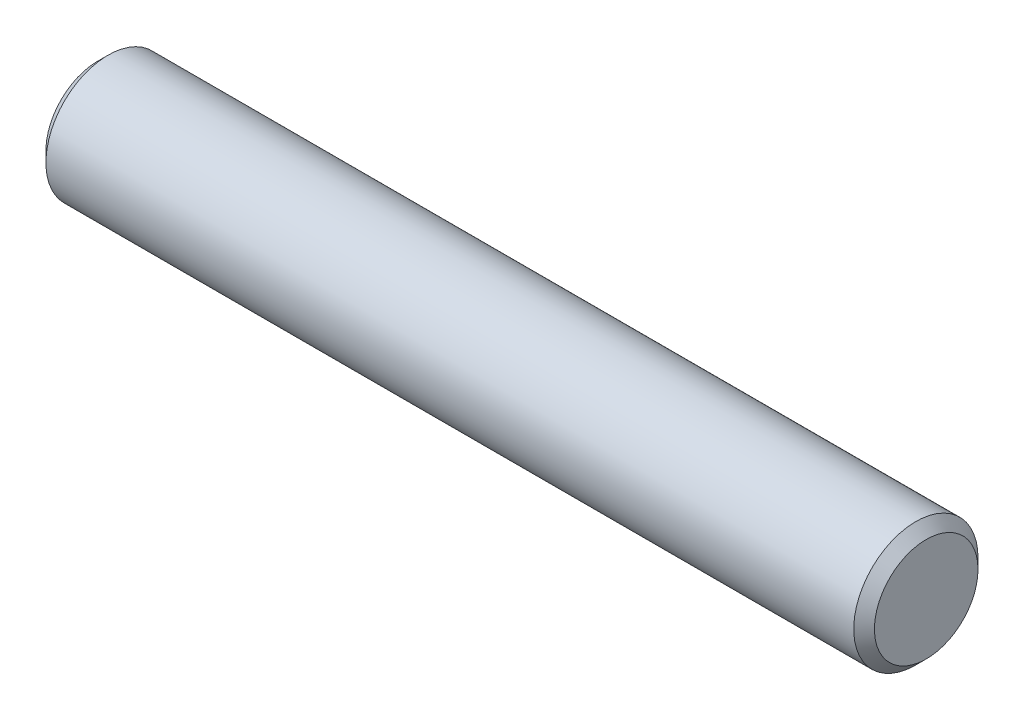
ISO-10303-21;
HEADER;
FILE_DESCRIPTION(('STEP AP214'),'2;1');
FILE_NAME('part.step','',(''),(''),'','','');
FILE_SCHEMA(('AUTOMOTIVE_DESIGN { 1 0 10303 214 1 1 1 1 }'));
ENDSEC;
DATA;
#1=APPLICATION_CONTEXT('core data for automotive mechanical design processes');
#2=APPLICATION_PROTOCOL_DEFINITION('international standard','automotive_design',2000,#1);
#3=PRODUCT_CONTEXT('',#1,'mechanical');
#4=PRODUCT('Part','Part','',(#3));
#5=PRODUCT_RELATED_PRODUCT_CATEGORY('part','',(#4));
#6=PRODUCT_DEFINITION_FORMATION('','',#4);
#7=PRODUCT_DEFINITION_CONTEXT('part definition',#1,'design');
#8=PRODUCT_DEFINITION('design','',#6,#7);
#9=PRODUCT_DEFINITION_SHAPE('','',#8);
#10=(LENGTH_UNIT() NAMED_UNIT(*) SI_UNIT(.MILLI.,.METRE.));
#11=(NAMED_UNIT(*) PLANE_ANGLE_UNIT() SI_UNIT($,.RADIAN.));
#12=(NAMED_UNIT(*) SI_UNIT($,.STERADIAN.) SOLID_ANGLE_UNIT());
#13=UNCERTAINTY_MEASURE_WITH_UNIT(LENGTH_MEASURE(1.E-05),#10,'distance_accuracy_value','');
#14=(GEOMETRIC_REPRESENTATION_CONTEXT(3) GLOBAL_UNCERTAINTY_ASSIGNED_CONTEXT((#13)) GLOBAL_UNIT_ASSIGNED_CONTEXT((#10,
#11,#12)) REPRESENTATION_CONTEXT('',''));
#15=CARTESIAN_POINT('',(0.,0.,0.));
#16=DIRECTION('',(0.,0.,1.));
#17=DIRECTION('',(1.,0.,0.));
#18=AXIS2_PLACEMENT_3D('',#15,#16,#17);
#19=CARTESIAN_POINT('',(20.,0.,0.));
#20=DIRECTION('',(-1.,0.,0.));
#21=DIRECTION('',(0.,0.,1.));
#22=AXIS2_PLACEMENT_3D('',#19,#20,#21);
#23=CYLINDRICAL_SURFACE('',#22,3.);
#24=CARTESIAN_POINT('',(-19.5,0.,0.));
#25=DIRECTION('',(1.,0.,0.));
#26=DIRECTION('',(0.,0.,-1.));
#27=AXIS2_PLACEMENT_3D('',#24,#25,#26);
#28=CIRCLE('',#27,3.);
#29=CARTESIAN_POINT('',(-19.5,0.,-3.));
#30=VERTEX_POINT('',#29);
#31=EDGE_CURVE('E53',#30,#30,#28,.T.);
#32=ORIENTED_EDGE('',*,*,#31,.T.);
#33=EDGE_LOOP('',(#32));
#34=FACE_BOUND('',#33,.T.);
#35=CARTESIAN_POINT('',(19.5,0.,0.));
#36=DIRECTION('',(1.,0.,0.));
#37=DIRECTION('',(0.,0.,-1.));
#38=AXIS2_PLACEMENT_3D('',#35,#36,#37);
#39=CIRCLE('',#38,3.);
#40=CARTESIAN_POINT('',(19.5,0.,-3.));
#41=VERTEX_POINT('',#40);
#42=EDGE_CURVE('E58',#41,#41,#39,.F.);
#43=ORIENTED_EDGE('',*,*,#42,.T.);
#44=EDGE_LOOP('',(#43));
#45=FACE_BOUND('',#44,.T.);
#46=ADVANCED_FACE('F39',(#34,#45),#23,.T.);
#47=CARTESIAN_POINT('',(20.,0.,0.));
#48=DIRECTION('',(1.,0.,0.));
#49=DIRECTION('',(0.,0.,-1.));
#50=AXIS2_PLACEMENT_3D('',#47,#48,#49);
#51=PLANE('',#50);
#52=CARTESIAN_POINT('',(20.,0.,0.));
#53=DIRECTION('',(1.,0.,0.));
#54=DIRECTION('',(0.,0.,-1.));
#55=AXIS2_PLACEMENT_3D('',#52,#53,#54);
#56=CIRCLE('',#55,2.5);
#57=CARTESIAN_POINT('',(20.,0.,-2.5));
#58=VERTEX_POINT('',#57);
#59=EDGE_CURVE('E10',#58,#58,#56,.T.);
#60=ORIENTED_EDGE('',*,*,#59,.T.);
#61=EDGE_LOOP('',(#60));
#62=FACE_BOUND('',#61,.T.);
#63=ADVANCED_FACE('F75',(#62),#51,.T.);
#64=CARTESIAN_POINT('',(-20.,0.,0.));
#65=DIRECTION('',(1.,0.,0.));
#66=DIRECTION('',(0.,0.,-1.));
#67=AXIS2_PLACEMENT_3D('',#64,#65,#66);
#68=PLANE('',#67);
#69=CARTESIAN_POINT('',(-20.,0.,0.));
#70=DIRECTION('',(1.,0.,0.));
#71=DIRECTION('',(0.,0.,-1.));
#72=AXIS2_PLACEMENT_3D('',#69,#70,#71);
#73=CIRCLE('',#72,2.49999999999999);
#74=CARTESIAN_POINT('',(-20.,0.,-2.49999999999999));
#75=VERTEX_POINT('',#74);
#76=EDGE_CURVE('E48',#75,#75,#73,.F.);
#77=ORIENTED_EDGE('',*,*,#76,.T.);
#78=EDGE_LOOP('',(#77));
#79=FACE_BOUND('',#78,.T.);
#80=ADVANCED_FACE('F72',(#79),#68,.F.);
#81=CARTESIAN_POINT('',(-19.5,0.,0.));
#82=DIRECTION('',(1.,0.,0.));
#83=DIRECTION('',(0.,0.,-1.));
#84=AXIS2_PLACEMENT_3D('',#81,#82,#83);
#85=CONICAL_SURFACE('',#84,3.,0.785398163397449);
#86=ORIENTED_EDGE('',*,*,#76,.F.);
#87=EDGE_LOOP('',(#86));
#88=FACE_BOUND('',#87,.T.);
#89=ORIENTED_EDGE('',*,*,#31,.F.);
#90=EDGE_LOOP('',(#89));
#91=FACE_BOUND('',#90,.T.);
#92=ADVANCED_FACE('F68',(#88,#91),#85,.T.);
#93=CARTESIAN_POINT('',(20.,0.,0.));
#94=DIRECTION('',(-1.,0.,0.));
#95=DIRECTION('',(0.,0.,1.));
#96=AXIS2_PLACEMENT_3D('',#93,#94,#95);
#97=CONICAL_SURFACE('',#96,2.5,0.785398163397449);
#98=ORIENTED_EDGE('',*,*,#42,.F.);
#99=EDGE_LOOP('',(#98));
#100=FACE_BOUND('',#99,.T.);
#101=ORIENTED_EDGE('',*,*,#59,.F.);
#102=EDGE_LOOP('',(#101));
#103=FACE_BOUND('',#102,.T.);
#104=ADVANCED_FACE('F42',(#100,#103),#97,.T.);
#105=CLOSED_SHELL('',(#46,#63,#80,#92,#104));
#106=MANIFOLD_SOLID_BREP('B2',#105);
#107=ADVANCED_BREP_SHAPE_REPRESENTATION('',(#18,#106),#14);
#108=SHAPE_DEFINITION_REPRESENTATION(#9,#107);
ENDSEC;
END-ISO-10303-21;
